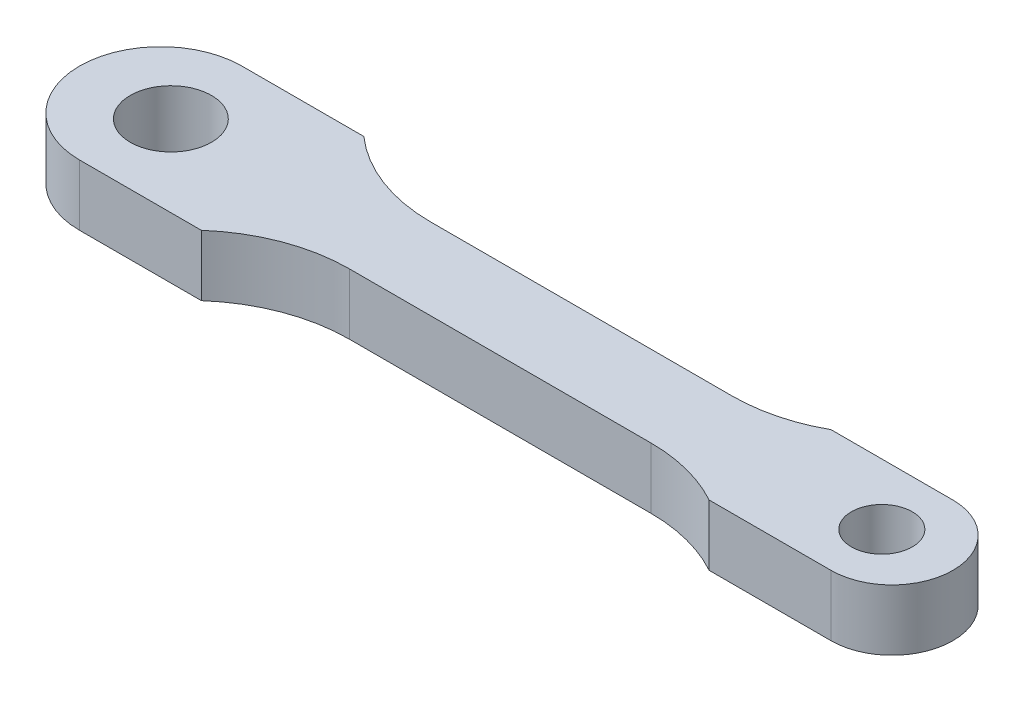
ISO-10303-21;
HEADER;
FILE_DESCRIPTION(('STEP AP214'),'2;1');
FILE_NAME('part.step','',(''),(''),'','','');
FILE_SCHEMA(('AUTOMOTIVE_DESIGN { 1 0 10303 214 1 1 1 1 }'));
ENDSEC;
DATA;
#1=APPLICATION_CONTEXT('core data for automotive mechanical design processes');
#2=APPLICATION_PROTOCOL_DEFINITION('international standard','automotive_design',2000,#1);
#3=PRODUCT_CONTEXT('',#1,'mechanical');
#4=PRODUCT('Part','Part','',(#3));
#5=PRODUCT_RELATED_PRODUCT_CATEGORY('part','',(#4));
#6=PRODUCT_DEFINITION_FORMATION('','',#4);
#7=PRODUCT_DEFINITION_CONTEXT('part definition',#1,'design');
#8=PRODUCT_DEFINITION('design','',#6,#7);
#9=PRODUCT_DEFINITION_SHAPE('','',#8);
#10=(LENGTH_UNIT() NAMED_UNIT(*) SI_UNIT(.MILLI.,.METRE.));
#11=(NAMED_UNIT(*) PLANE_ANGLE_UNIT() SI_UNIT($,.RADIAN.));
#12=(NAMED_UNIT(*) SI_UNIT($,.STERADIAN.) SOLID_ANGLE_UNIT());
#13=UNCERTAINTY_MEASURE_WITH_UNIT(LENGTH_MEASURE(1.E-05),#10,'distance_accuracy_value','');
#14=(GEOMETRIC_REPRESENTATION_CONTEXT(3) GLOBAL_UNCERTAINTY_ASSIGNED_CONTEXT((#13)) GLOBAL_UNIT_ASSIGNED_CONTEXT((#10,
#11,#12)) REPRESENTATION_CONTEXT('',''));
#15=CARTESIAN_POINT('',(0.,0.,0.));
#16=DIRECTION('',(0.,0.,1.));
#17=DIRECTION('',(1.,0.,0.));
#18=AXIS2_PLACEMENT_3D('',#15,#16,#17);
#19=CARTESIAN_POINT('',(0.,1.5,-2.));
#20=DIRECTION('',(0.,0.,-1.));
#21=DIRECTION('',(-1.,0.,0.));
#22=AXIS2_PLACEMENT_3D('',#19,#20,#21);
#23=PLANE('',#22);
#24=DIRECTION('',(1.,0.,0.));
#25=VECTOR('',#24,1.);
#26=CARTESIAN_POINT('',(0.,1.5,-2.));
#27=LINE('',#26,#25);
#28=CARTESIAN_POINT('',(-6.70849737787082,1.5,-2.));
#29=VERTEX_POINT('',#28);
#30=CARTESIAN_POINT('',(8.12701665379258,1.5,-2.));
#31=VERTEX_POINT('',#30);
#32=EDGE_CURVE('E150',#29,#31,#27,.T.);
#33=ORIENTED_EDGE('',*,*,#32,.T.);
#34=DIRECTION('',(0.,-1.,0.));
#35=VECTOR('',#34,1.);
#36=CARTESIAN_POINT('',(8.12701665379258,1.5,-2.));
#37=LINE('',#36,#35);
#38=CARTESIAN_POINT('',(8.12701665379258,-1.5,-2.));
#39=VERTEX_POINT('',#38);
#40=EDGE_CURVE('E167',#31,#39,#37,.T.);
#41=ORIENTED_EDGE('',*,*,#40,.T.);
#42=DIRECTION('',(1.,0.,0.));
#43=VECTOR('',#42,1.);
#44=CARTESIAN_POINT('',(0.,-1.5,-2.));
#45=LINE('',#44,#43);
#46=CARTESIAN_POINT('',(-6.70849737787082,-1.5,-2.));
#47=VERTEX_POINT('',#46);
#48=EDGE_CURVE('E182',#47,#39,#45,.T.);
#49=ORIENTED_EDGE('',*,*,#48,.F.);
#50=DIRECTION('',(0.,-1.,0.));
#51=VECTOR('',#50,1.);
#52=CARTESIAN_POINT('',(-6.70849737787082,1.5,-2.));
#53=LINE('',#52,#51);
#54=EDGE_CURVE('E139',#29,#47,#53,.T.);
#55=ORIENTED_EDGE('',*,*,#54,.F.);
#56=EDGE_LOOP('',(#33,#41,#49,#55));
#57=FACE_BOUND('',#56,.T.);
#58=ADVANCED_FACE('F41',(#57),#23,.T.);
#59=CARTESIAN_POINT('',(0.,1.5,4.));
#60=DIRECTION('',(0.,0.,1.));
#61=DIRECTION('',(1.,0.,0.));
#62=AXIS2_PLACEMENT_3D('',#59,#60,#61);
#63=PLANE('',#62);
#64=DIRECTION('',(-1.,0.,0.));
#65=VECTOR('',#64,1.);
#66=CARTESIAN_POINT('',(0.,-1.5,4.));
#67=LINE('',#66,#65);
#68=CARTESIAN_POINT('',(-12.,-1.5,4.));
#69=VERTEX_POINT('',#68);
#70=CARTESIAN_POINT('',(-18.,-1.5,4.));
#71=VERTEX_POINT('',#70);
#72=EDGE_CURVE('E163',#69,#71,#67,.T.);
#73=ORIENTED_EDGE('',*,*,#72,.F.);
#74=DIRECTION('',(0.,-1.,0.));
#75=VECTOR('',#74,1.);
#76=CARTESIAN_POINT('',(-12.,1.5,4.));
#77=LINE('',#76,#75);
#78=CARTESIAN_POINT('',(-12.,1.5,4.));
#79=VERTEX_POINT('',#78);
#80=EDGE_CURVE('E11',#79,#69,#77,.T.);
#81=ORIENTED_EDGE('',*,*,#80,.F.);
#82=DIRECTION('',(-1.,0.,0.));
#83=VECTOR('',#82,1.);
#84=CARTESIAN_POINT('',(0.,1.5,4.));
#85=LINE('',#84,#83);
#86=CARTESIAN_POINT('',(-18.,1.5,4.));
#87=VERTEX_POINT('',#86);
#88=EDGE_CURVE('E195',#79,#87,#85,.T.);
#89=ORIENTED_EDGE('',*,*,#88,.T.);
#90=DIRECTION('',(0.,-1.,0.));
#91=VECTOR('',#90,1.);
#92=CARTESIAN_POINT('',(-18.,1.5,4.));
#93=LINE('',#92,#91);
#94=EDGE_CURVE('E102',#87,#71,#93,.T.);
#95=ORIENTED_EDGE('',*,*,#94,.T.);
#96=EDGE_LOOP('',(#73,#81,#89,#95));
#97=FACE_BOUND('',#96,.T.);
#98=ADVANCED_FACE('F43',(#97),#63,.T.);
#99=CARTESIAN_POINT('',(-6.70849737787082,1.5,10.));
#100=DIRECTION('',(0.,-1.,0.));
#101=DIRECTION('',(0.,0.,-1.));
#102=AXIS2_PLACEMENT_3D('',#99,#100,#101);
#103=CYLINDRICAL_SURFACE('',#102,8.);
#104=CARTESIAN_POINT('',(-6.70849737787082,-1.5,10.));
#105=DIRECTION('',(0.,1.,0.));
#106=DIRECTION('',(0.,0.,1.));
#107=AXIS2_PLACEMENT_3D('',#104,#105,#106);
#108=CIRCLE('',#107,8.);
#109=CARTESIAN_POINT('',(-6.70849737787082,-1.5,2.));
#110=VERTEX_POINT('',#109);
#111=EDGE_CURVE('E166',#69,#110,#108,.F.);
#112=ORIENTED_EDGE('',*,*,#111,.T.);
#113=DIRECTION('',(0.,-1.,0.));
#114=VECTOR('',#113,1.);
#115=CARTESIAN_POINT('',(-6.70849737787082,1.5,2.));
#116=LINE('',#115,#114);
#117=CARTESIAN_POINT('',(-6.70849737787082,1.5,2.));
#118=VERTEX_POINT('',#117);
#119=EDGE_CURVE('E50',#118,#110,#116,.T.);
#120=ORIENTED_EDGE('',*,*,#119,.F.);
#121=CARTESIAN_POINT('',(-6.70849737787082,1.5,10.));
#122=DIRECTION('',(0.,1.,0.));
#123=DIRECTION('',(0.,0.,1.));
#124=AXIS2_PLACEMENT_3D('',#121,#122,#123);
#125=CIRCLE('',#124,8.);
#126=EDGE_CURVE('E267',#79,#118,#125,.F.);
#127=ORIENTED_EDGE('',*,*,#126,.F.);
#128=ORIENTED_EDGE('',*,*,#80,.T.);
#129=EDGE_LOOP('',(#112,#120,#127,#128));
#130=FACE_BOUND('',#129,.T.);
#131=ADVANCED_FACE('F270',(#130),#103,.F.);
#132=CARTESIAN_POINT('',(0.,1.5,2.));
#133=DIRECTION('',(0.,0.,-1.));
#134=DIRECTION('',(-1.,0.,0.));
#135=AXIS2_PLACEMENT_3D('',#132,#133,#134);
#136=PLANE('',#135);
#137=DIRECTION('',(1.,0.,0.));
#138=VECTOR('',#137,1.);
#139=CARTESIAN_POINT('',(0.,-1.5,2.));
#140=LINE('',#139,#138);
#141=CARTESIAN_POINT('',(8.12701665379258,-1.5,2.));
#142=VERTEX_POINT('',#141);
#143=EDGE_CURVE('E169',#110,#142,#140,.T.);
#144=ORIENTED_EDGE('',*,*,#143,.T.);
#145=DIRECTION('',(0.,-1.,0.));
#146=VECTOR('',#145,1.);
#147=CARTESIAN_POINT('',(8.12701665379258,1.5,2.));
#148=LINE('',#147,#146);
#149=CARTESIAN_POINT('',(8.12701665379258,1.5,2.));
#150=VERTEX_POINT('',#149);
#151=EDGE_CURVE('E209',#150,#142,#148,.T.);
#152=ORIENTED_EDGE('',*,*,#151,.F.);
#153=DIRECTION('',(1.,0.,0.));
#154=VECTOR('',#153,1.);
#155=CARTESIAN_POINT('',(0.,1.5,2.));
#156=LINE('',#155,#154);
#157=EDGE_CURVE('E218',#118,#150,#156,.T.);
#158=ORIENTED_EDGE('',*,*,#157,.F.);
#159=ORIENTED_EDGE('',*,*,#119,.T.);
#160=EDGE_LOOP('',(#144,#152,#158,#159));
#161=FACE_BOUND('',#160,.T.);
#162=ADVANCED_FACE('F216',(#161),#136,.F.);
#163=CARTESIAN_POINT('',(8.12701665379258,1.5,10.));
#164=DIRECTION('',(0.,-1.,0.));
#165=DIRECTION('',(0.,0.,-1.));
#166=AXIS2_PLACEMENT_3D('',#163,#164,#165);
#167=CYLINDRICAL_SURFACE('',#166,8.);
#168=CARTESIAN_POINT('',(8.12701665379258,-1.5,10.));
#169=DIRECTION('',(0.,1.,0.));
#170=DIRECTION('',(0.,0.,1.));
#171=AXIS2_PLACEMENT_3D('',#168,#169,#170);
#172=CIRCLE('',#171,8.);
#173=CARTESIAN_POINT('',(12.,-1.5,3.));
#174=VERTEX_POINT('',#173);
#175=EDGE_CURVE('E171',#142,#174,#172,.F.);
#176=ORIENTED_EDGE('',*,*,#175,.T.);
#177=DIRECTION('',(0.,-1.,0.));
#178=VECTOR('',#177,1.);
#179=CARTESIAN_POINT('',(12.,1.5,3.));
#180=LINE('',#179,#178);
#181=CARTESIAN_POINT('',(12.,1.5,3.));
#182=VERTEX_POINT('',#181);
#183=EDGE_CURVE('E206',#182,#174,#180,.T.);
#184=ORIENTED_EDGE('',*,*,#183,.F.);
#185=CARTESIAN_POINT('',(8.12701665379258,1.5,10.));
#186=DIRECTION('',(0.,1.,0.));
#187=DIRECTION('',(0.,0.,1.));
#188=AXIS2_PLACEMENT_3D('',#185,#186,#187);
#189=CIRCLE('',#188,8.);
#190=EDGE_CURVE('E238',#150,#182,#189,.F.);
#191=ORIENTED_EDGE('',*,*,#190,.F.);
#192=ORIENTED_EDGE('',*,*,#151,.T.);
#193=EDGE_LOOP('',(#176,#184,#191,#192));
#194=FACE_BOUND('',#193,.T.);
#195=ADVANCED_FACE('F228',(#194),#167,.F.);
#196=CARTESIAN_POINT('',(0.,1.5,3.));
#197=DIRECTION('',(0.,0.,-1.));
#198=DIRECTION('',(-1.,0.,0.));
#199=AXIS2_PLACEMENT_3D('',#196,#197,#198);
#200=PLANE('',#199);
#201=DIRECTION('',(1.,0.,0.));
#202=VECTOR('',#201,1.);
#203=CARTESIAN_POINT('',(0.,-1.5,3.));
#204=LINE('',#203,#202);
#205=CARTESIAN_POINT('',(18.,-1.5,3.));
#206=VERTEX_POINT('',#205);
#207=EDGE_CURVE('E173',#174,#206,#204,.T.);
#208=ORIENTED_EDGE('',*,*,#207,.T.);
#209=DIRECTION('',(0.,-1.,0.));
#210=VECTOR('',#209,1.);
#211=CARTESIAN_POINT('',(18.,1.5,3.));
#212=LINE('',#211,#210);
#213=CARTESIAN_POINT('',(18.,1.5,3.));
#214=VERTEX_POINT('',#213);
#215=EDGE_CURVE('E204',#214,#206,#212,.T.);
#216=ORIENTED_EDGE('',*,*,#215,.F.);
#217=DIRECTION('',(1.,0.,0.));
#218=VECTOR('',#217,1.);
#219=CARTESIAN_POINT('',(0.,1.5,3.));
#220=LINE('',#219,#218);
#221=EDGE_CURVE('E234',#182,#214,#220,.T.);
#222=ORIENTED_EDGE('',*,*,#221,.F.);
#223=ORIENTED_EDGE('',*,*,#183,.T.);
#224=EDGE_LOOP('',(#208,#216,#222,#223));
#225=FACE_BOUND('',#224,.T.);
#226=ADVANCED_FACE('F232',(#225),#200,.F.);
#227=CARTESIAN_POINT('',(18.,1.5,0.));
#228=DIRECTION('',(0.,-1.,0.));
#229=DIRECTION('',(0.,0.,-1.));
#230=AXIS2_PLACEMENT_3D('',#227,#228,#229);
#231=CYLINDRICAL_SURFACE('',#230,3.);
#232=CARTESIAN_POINT('',(18.,-1.5,0.));
#233=DIRECTION('',(0.,1.,0.));
#234=DIRECTION('',(0.,0.,1.));
#235=AXIS2_PLACEMENT_3D('',#232,#233,#234);
#236=CIRCLE('',#235,3.);
#237=CARTESIAN_POINT('',(18.,-1.5,-3.));
#238=VERTEX_POINT('',#237);
#239=EDGE_CURVE('E176',#238,#206,#236,.F.);
#240=ORIENTED_EDGE('',*,*,#239,.F.);
#241=DIRECTION('',(0.,-1.,0.));
#242=VECTOR('',#241,1.);
#243=CARTESIAN_POINT('',(18.,1.5,-3.));
#244=LINE('',#243,#242);
#245=CARTESIAN_POINT('',(18.,1.5,-3.));
#246=VERTEX_POINT('',#245);
#247=EDGE_CURVE('E202',#246,#238,#244,.T.);
#248=ORIENTED_EDGE('',*,*,#247,.F.);
#249=CARTESIAN_POINT('',(18.,1.5,0.));
#250=DIRECTION('',(0.,1.,0.));
#251=DIRECTION('',(0.,0.,1.));
#252=AXIS2_PLACEMENT_3D('',#249,#250,#251);
#253=CIRCLE('',#252,3.);
#254=EDGE_CURVE('E237',#246,#214,#253,.F.);
#255=ORIENTED_EDGE('',*,*,#254,.T.);
#256=ORIENTED_EDGE('',*,*,#215,.T.);
#257=EDGE_LOOP('',(#240,#248,#255,#256));
#258=FACE_BOUND('',#257,.T.);
#259=ADVANCED_FACE('F287',(#258),#231,.T.);
#260=CARTESIAN_POINT('',(0.,1.5,-3.));
#261=DIRECTION('',(0.,0.,-1.));
#262=DIRECTION('',(-1.,0.,0.));
#263=AXIS2_PLACEMENT_3D('',#260,#261,#262);
#264=PLANE('',#263);
#265=DIRECTION('',(1.,0.,0.));
#266=VECTOR('',#265,1.);
#267=CARTESIAN_POINT('',(0.,-1.5,-3.));
#268=LINE('',#267,#266);
#269=CARTESIAN_POINT('',(12.,-1.5,-3.));
#270=VERTEX_POINT('',#269);
#271=EDGE_CURVE('E179',#270,#238,#268,.T.);
#272=ORIENTED_EDGE('',*,*,#271,.F.);
#273=DIRECTION('',(0.,-1.,0.));
#274=VECTOR('',#273,1.);
#275=CARTESIAN_POINT('',(12.,1.5,-3.));
#276=LINE('',#275,#274);
#277=CARTESIAN_POINT('',(12.,1.5,-3.));
#278=VERTEX_POINT('',#277);
#279=EDGE_CURVE('E199',#278,#270,#276,.T.);
#280=ORIENTED_EDGE('',*,*,#279,.F.);
#281=DIRECTION('',(1.,0.,0.));
#282=VECTOR('',#281,1.);
#283=CARTESIAN_POINT('',(0.,1.5,-3.));
#284=LINE('',#283,#282);
#285=EDGE_CURVE('E152',#278,#246,#284,.T.);
#286=ORIENTED_EDGE('',*,*,#285,.T.);
#287=ORIENTED_EDGE('',*,*,#247,.T.);
#288=EDGE_LOOP('',(#272,#280,#286,#287));
#289=FACE_BOUND('',#288,.T.);
#290=ADVANCED_FACE('F248',(#289),#264,.T.);
#291=CARTESIAN_POINT('',(-6.70849737787082,1.5,-10.));
#292=DIRECTION('',(0.,-1.,0.));
#293=DIRECTION('',(0.,0.,-1.));
#294=AXIS2_PLACEMENT_3D('',#291,#292,#293);
#295=CYLINDRICAL_SURFACE('',#294,8.);
#296=CARTESIAN_POINT('',(-6.70849737787082,-1.5,-10.));
#297=DIRECTION('',(0.,1.,0.));
#298=DIRECTION('',(0.,0.,1.));
#299=AXIS2_PLACEMENT_3D('',#296,#297,#298);
#300=CIRCLE('',#299,8.);
#301=CARTESIAN_POINT('',(-12.,-1.5,-4.));
#302=VERTEX_POINT('',#301);
#303=EDGE_CURVE('E138',#302,#47,#300,.T.);
#304=ORIENTED_EDGE('',*,*,#303,.F.);
#305=DIRECTION('',(0.,-1.,0.));
#306=VECTOR('',#305,1.);
#307=CARTESIAN_POINT('',(-12.,1.5,-4.));
#308=LINE('',#307,#306);
#309=CARTESIAN_POINT('',(-12.,1.5,-4.));
#310=VERTEX_POINT('',#309);
#311=EDGE_CURVE('E132',#310,#302,#308,.T.);
#312=ORIENTED_EDGE('',*,*,#311,.F.);
#313=CARTESIAN_POINT('',(-6.70849737787082,1.5,-10.));
#314=DIRECTION('',(0.,1.,0.));
#315=DIRECTION('',(0.,0.,1.));
#316=AXIS2_PLACEMENT_3D('',#313,#314,#315);
#317=CIRCLE('',#316,8.);
#318=EDGE_CURVE('E136',#310,#29,#317,.T.);
#319=ORIENTED_EDGE('',*,*,#318,.T.);
#320=ORIENTED_EDGE('',*,*,#54,.T.);
#321=EDGE_LOOP('',(#304,#312,#319,#320));
#322=FACE_BOUND('',#321,.T.);
#323=ADVANCED_FACE('F134',(#322),#295,.F.);
#324=CARTESIAN_POINT('',(0.,1.5,-4.));
#325=DIRECTION('',(0.,0.,1.));
#326=DIRECTION('',(1.,0.,0.));
#327=AXIS2_PLACEMENT_3D('',#324,#325,#326);
#328=PLANE('',#327);
#329=DIRECTION('',(-1.,0.,0.));
#330=VECTOR('',#329,1.);
#331=CARTESIAN_POINT('',(0.,-1.5,-4.));
#332=LINE('',#331,#330);
#333=CARTESIAN_POINT('',(-18.,-1.5,-4.));
#334=VERTEX_POINT('',#333);
#335=EDGE_CURVE('E95',#302,#334,#332,.T.);
#336=ORIENTED_EDGE('',*,*,#335,.T.);
#337=DIRECTION('',(0.,-1.,0.));
#338=VECTOR('',#337,1.);
#339=CARTESIAN_POINT('',(-18.,1.5,-4.));
#340=LINE('',#339,#338);
#341=CARTESIAN_POINT('',(-18.,1.5,-4.));
#342=VERTEX_POINT('',#341);
#343=EDGE_CURVE('E140',#342,#334,#340,.T.);
#344=ORIENTED_EDGE('',*,*,#343,.F.);
#345=DIRECTION('',(-1.,0.,0.));
#346=VECTOR('',#345,1.);
#347=CARTESIAN_POINT('',(0.,1.5,-4.));
#348=LINE('',#347,#346);
#349=EDGE_CURVE('E142',#310,#342,#348,.T.);
#350=ORIENTED_EDGE('',*,*,#349,.F.);
#351=ORIENTED_EDGE('',*,*,#311,.T.);
#352=EDGE_LOOP('',(#336,#344,#350,#351));
#353=FACE_BOUND('',#352,.T.);
#354=ADVANCED_FACE('F143',(#353),#328,.F.);
#355=CARTESIAN_POINT('',(-17.5,1.5,0.));
#356=DIRECTION('',(0.,-1.,0.));
#357=DIRECTION('',(0.,0.,-1.));
#358=AXIS2_PLACEMENT_3D('',#355,#356,#357);
#359=CYLINDRICAL_SURFACE('',#358,2.);
#360=CARTESIAN_POINT('',(-17.5,1.5,0.));
#361=DIRECTION('',(0.,1.,0.));
#362=DIRECTION('',(0.,0.,1.));
#363=AXIS2_PLACEMENT_3D('',#360,#361,#362);
#364=CIRCLE('',#363,2.);
#365=CARTESIAN_POINT('',(-17.5,1.5,2.));
#366=VERTEX_POINT('',#365);
#367=EDGE_CURVE('E157',#366,#366,#364,.T.);
#368=ORIENTED_EDGE('',*,*,#367,.T.);
#369=EDGE_LOOP('',(#368));
#370=FACE_BOUND('',#369,.T.);
#371=CARTESIAN_POINT('',(-17.5,-1.5,0.));
#372=DIRECTION('',(0.,1.,0.));
#373=DIRECTION('',(0.,0.,1.));
#374=AXIS2_PLACEMENT_3D('',#371,#372,#373);
#375=CIRCLE('',#374,2.);
#376=CARTESIAN_POINT('',(-17.5,-1.5,2.));
#377=VERTEX_POINT('',#376);
#378=EDGE_CURVE('E189',#377,#377,#375,.T.);
#379=ORIENTED_EDGE('',*,*,#378,.F.);
#380=EDGE_LOOP('',(#379));
#381=FACE_BOUND('',#380,.T.);
#382=ADVANCED_FACE('F322',(#370,#381),#359,.F.);
#383=CARTESIAN_POINT('',(-18.,1.5,0.));
#384=DIRECTION('',(0.,-1.,0.));
#385=DIRECTION('',(0.,0.,-1.));
#386=AXIS2_PLACEMENT_3D('',#383,#384,#385);
#387=CYLINDRICAL_SURFACE('',#386,4.);
#388=CARTESIAN_POINT('',(-18.,-1.5,0.));
#389=DIRECTION('',(0.,1.,0.));
#390=DIRECTION('',(0.,0.,1.));
#391=AXIS2_PLACEMENT_3D('',#388,#389,#390);
#392=CIRCLE('',#391,4.);
#393=EDGE_CURVE('E187',#334,#71,#392,.T.);
#394=ORIENTED_EDGE('',*,*,#393,.T.);
#395=ORIENTED_EDGE('',*,*,#94,.F.);
#396=CARTESIAN_POINT('',(-18.,1.5,0.));
#397=DIRECTION('',(0.,1.,0.));
#398=DIRECTION('',(0.,0.,1.));
#399=AXIS2_PLACEMENT_3D('',#396,#397,#398);
#400=CIRCLE('',#399,4.);
#401=EDGE_CURVE('E58',#342,#87,#400,.T.);
#402=ORIENTED_EDGE('',*,*,#401,.F.);
#403=ORIENTED_EDGE('',*,*,#343,.T.);
#404=EDGE_LOOP('',(#394,#395,#402,#403));
#405=FACE_BOUND('',#404,.T.);
#406=ADVANCED_FACE('F266',(#405),#387,.T.);
#407=CARTESIAN_POINT('',(17.5,1.5,0.));
#408=DIRECTION('',(0.,-1.,0.));
#409=DIRECTION('',(0.,0.,-1.));
#410=AXIS2_PLACEMENT_3D('',#407,#408,#409);
#411=CYLINDRICAL_SURFACE('',#410,1.5);
#412=CARTESIAN_POINT('',(17.5,1.5,0.));
#413=DIRECTION('',(0.,1.,0.));
#414=DIRECTION('',(0.,0.,1.));
#415=AXIS2_PLACEMENT_3D('',#412,#413,#414);
#416=CIRCLE('',#415,1.5);
#417=CARTESIAN_POINT('',(17.5,1.5,1.5));
#418=VERTEX_POINT('',#417);
#419=EDGE_CURVE('E160',#418,#418,#416,.T.);
#420=ORIENTED_EDGE('',*,*,#419,.T.);
#421=EDGE_LOOP('',(#420));
#422=FACE_BOUND('',#421,.T.);
#423=CARTESIAN_POINT('',(17.5,-1.5,0.));
#424=DIRECTION('',(0.,1.,0.));
#425=DIRECTION('',(0.,0.,1.));
#426=AXIS2_PLACEMENT_3D('',#423,#424,#425);
#427=CIRCLE('',#426,1.5);
#428=CARTESIAN_POINT('',(17.5,-1.5,1.5));
#429=VERTEX_POINT('',#428);
#430=EDGE_CURVE('E192',#429,#429,#427,.T.);
#431=ORIENTED_EDGE('',*,*,#430,.F.);
#432=EDGE_LOOP('',(#431));
#433=FACE_BOUND('',#432,.T.);
#434=ADVANCED_FACE('F336',(#422,#433),#411,.F.);
#435=CARTESIAN_POINT('',(0.,1.5,0.));
#436=DIRECTION('',(0.,1.,0.));
#437=DIRECTION('',(0.,0.,1.));
#438=AXIS2_PLACEMENT_3D('',#435,#436,#437);
#439=PLANE('',#438);
#440=ORIENTED_EDGE('',*,*,#88,.F.);
#441=ORIENTED_EDGE('',*,*,#126,.T.);
#442=ORIENTED_EDGE('',*,*,#157,.T.);
#443=ORIENTED_EDGE('',*,*,#190,.T.);
#444=ORIENTED_EDGE('',*,*,#221,.T.);
#445=ORIENTED_EDGE('',*,*,#254,.F.);
#446=ORIENTED_EDGE('',*,*,#285,.F.);
#447=CARTESIAN_POINT('',(8.12701665379258,1.5,-10.));
#448=DIRECTION('',(0.,-1.,0.));
#449=DIRECTION('',(0.,0.,1.));
#450=AXIS2_PLACEMENT_3D('',#447,#448,#449);
#451=CIRCLE('',#450,8.);
#452=EDGE_CURVE('E252',#278,#31,#451,.T.);
#453=ORIENTED_EDGE('',*,*,#452,.T.);
#454=ORIENTED_EDGE('',*,*,#32,.F.);
#455=ORIENTED_EDGE('',*,*,#318,.F.);
#456=ORIENTED_EDGE('',*,*,#349,.T.);
#457=ORIENTED_EDGE('',*,*,#401,.T.);
#458=EDGE_LOOP('',(#440,#441,#442,#443,#444,#445,#446,#453,#454,#455,#456,#457));
#459=FACE_BOUND('',#458,.T.);
#460=ORIENTED_EDGE('',*,*,#367,.F.);
#461=EDGE_LOOP('',(#460));
#462=FACE_BOUND('',#461,.T.);
#463=ORIENTED_EDGE('',*,*,#419,.F.);
#464=EDGE_LOOP('',(#463));
#465=FACE_BOUND('',#464,.T.);
#466=ADVANCED_FACE('F146',(#459,#462,#465),#439,.T.);
#467=CARTESIAN_POINT('',(0.,-1.5,0.));
#468=DIRECTION('',(0.,1.,0.));
#469=DIRECTION('',(0.,0.,1.));
#470=AXIS2_PLACEMENT_3D('',#467,#468,#469);
#471=PLANE('',#470);
#472=ORIENTED_EDGE('',*,*,#72,.T.);
#473=ORIENTED_EDGE('',*,*,#393,.F.);
#474=ORIENTED_EDGE('',*,*,#335,.F.);
#475=ORIENTED_EDGE('',*,*,#303,.T.);
#476=ORIENTED_EDGE('',*,*,#48,.T.);
#477=CARTESIAN_POINT('',(8.12701665379258,-1.5,-10.));
#478=DIRECTION('',(0.,-1.,0.));
#479=DIRECTION('',(0.,0.,1.));
#480=AXIS2_PLACEMENT_3D('',#477,#478,#479);
#481=CIRCLE('',#480,8.);
#482=EDGE_CURVE('E257',#270,#39,#481,.T.);
#483=ORIENTED_EDGE('',*,*,#482,.F.);
#484=ORIENTED_EDGE('',*,*,#271,.T.);
#485=ORIENTED_EDGE('',*,*,#239,.T.);
#486=ORIENTED_EDGE('',*,*,#207,.F.);
#487=ORIENTED_EDGE('',*,*,#175,.F.);
#488=ORIENTED_EDGE('',*,*,#143,.F.);
#489=ORIENTED_EDGE('',*,*,#111,.F.);
#490=EDGE_LOOP('',(#472,#473,#474,#475,#476,#483,#484,#485,#486,#487,#488,#489));
#491=FACE_BOUND('',#490,.T.);
#492=ORIENTED_EDGE('',*,*,#378,.T.);
#493=EDGE_LOOP('',(#492));
#494=FACE_BOUND('',#493,.T.);
#495=ORIENTED_EDGE('',*,*,#430,.T.);
#496=EDGE_LOOP('',(#495));
#497=FACE_BOUND('',#496,.T.);
#498=ADVANCED_FACE('F223',(#491,#494,#497),#471,.F.);
#499=CARTESIAN_POINT('',(8.12701665379258,1.5,-10.));
#500=DIRECTION('',(0.,-1.,0.));
#501=DIRECTION('',(0.,0.,-1.));
#502=AXIS2_PLACEMENT_3D('',#499,#500,#501);
#503=CYLINDRICAL_SURFACE('',#502,8.);
#504=ORIENTED_EDGE('',*,*,#482,.T.);
#505=ORIENTED_EDGE('',*,*,#40,.F.);
#506=ORIENTED_EDGE('',*,*,#452,.F.);
#507=ORIENTED_EDGE('',*,*,#279,.T.);
#508=EDGE_LOOP('',(#504,#505,#506,#507));
#509=FACE_BOUND('',#508,.T.);
#510=ADVANCED_FACE('F259',(#509),#503,.F.);
#511=CLOSED_SHELL('',(#58,#98,#131,#162,#195,#226,#259,#290,#323,#354,#382,#406,#434,#466,#498,#510));
#512=MANIFOLD_SOLID_BREP('B2',#511);
#513=ADVANCED_BREP_SHAPE_REPRESENTATION('',(#18,#512),#14);
#514=SHAPE_DEFINITION_REPRESENTATION(#9,#513);
ENDSEC;
END-ISO-10303-21;
